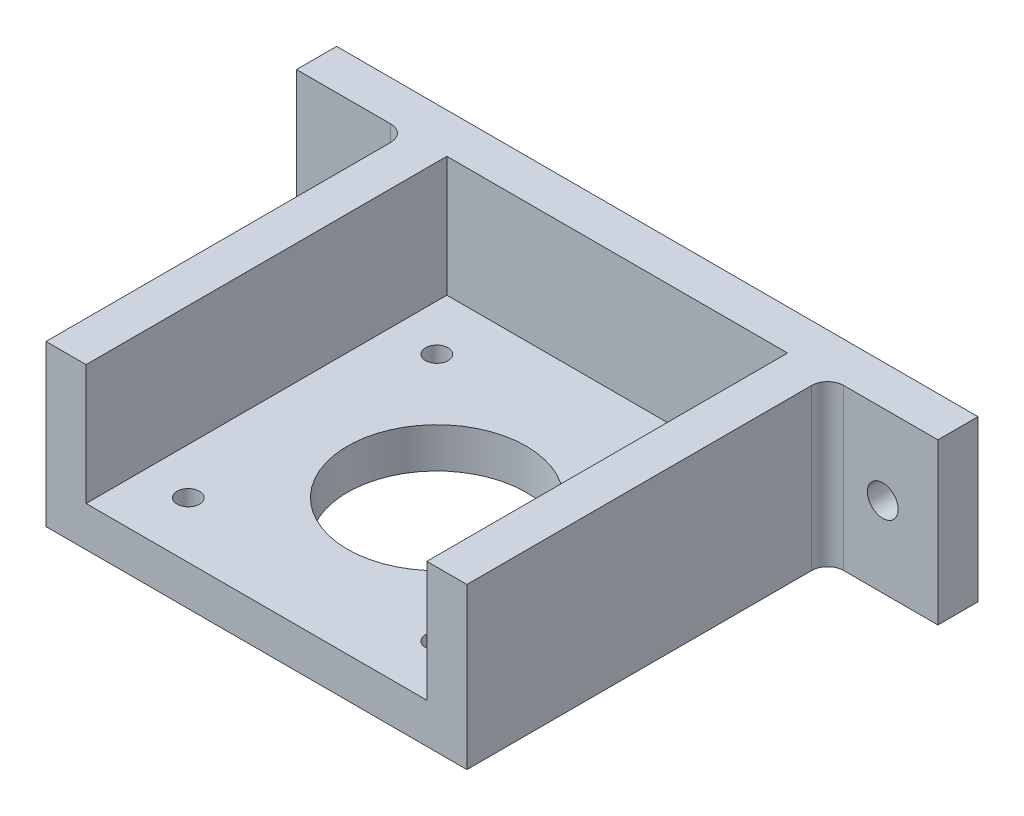
ISO-10303-21;
HEADER;
FILE_DESCRIPTION(('STEP AP214'),'2;1');
FILE_NAME('part.step','',(''),(''),'','','');
FILE_SCHEMA(('AUTOMOTIVE_DESIGN { 1 0 10303 214 1 1 1 1 }'));
ENDSEC;
DATA;
#1=APPLICATION_CONTEXT('core data for automotive mechanical design processes');
#2=APPLICATION_PROTOCOL_DEFINITION('international standard','automotive_design',2000,#1);
#3=PRODUCT_CONTEXT('',#1,'mechanical');
#4=PRODUCT('Part','Part','',(#3));
#5=PRODUCT_RELATED_PRODUCT_CATEGORY('part','',(#4));
#6=PRODUCT_DEFINITION_FORMATION('','',#4);
#7=PRODUCT_DEFINITION_CONTEXT('part definition',#1,'design');
#8=PRODUCT_DEFINITION('design','',#6,#7);
#9=PRODUCT_DEFINITION_SHAPE('','',#8);
#10=(LENGTH_UNIT() NAMED_UNIT(*) SI_UNIT(.MILLI.,.METRE.));
#11=(NAMED_UNIT(*) PLANE_ANGLE_UNIT() SI_UNIT($,.RADIAN.));
#12=(NAMED_UNIT(*) SI_UNIT($,.STERADIAN.) SOLID_ANGLE_UNIT());
#13=UNCERTAINTY_MEASURE_WITH_UNIT(LENGTH_MEASURE(1.E-05),#10,'distance_accuracy_value','');
#14=(GEOMETRIC_REPRESENTATION_CONTEXT(3) GLOBAL_UNCERTAINTY_ASSIGNED_CONTEXT((#13)) GLOBAL_UNIT_ASSIGNED_CONTEXT((#10,
#11,#12)) REPRESENTATION_CONTEXT('',''));
#15=CARTESIAN_POINT('',(0.,0.,0.));
#16=DIRECTION('',(0.,0.,1.));
#17=DIRECTION('',(1.,0.,0.));
#18=AXIS2_PLACEMENT_3D('',#15,#16,#17);
#19=CARTESIAN_POINT('',(-26.25,0.,45.));
#20=DIRECTION('',(1.,0.,0.));
#21=DIRECTION('',(0.,0.,-1.));
#22=AXIS2_PLACEMENT_3D('',#19,#20,#21);
#23=PLANE('',#22);
#24=DIRECTION('',(0.,0.,-1.));
#25=VECTOR('',#24,1.);
#26=CARTESIAN_POINT('',(-26.25,20.,45.));
#27=LINE('',#26,#25);
#28=CARTESIAN_POINT('',(-26.25,20.,45.));
#29=VERTEX_POINT('',#28);
#30=CARTESIAN_POINT('',(-26.25,20.,2.00000000000002));
#31=VERTEX_POINT('',#30);
#32=EDGE_CURVE('E198',#29,#31,#27,.T.);
#33=ORIENTED_EDGE('',*,*,#32,.T.);
#34=DIRECTION('',(0.,-1.,0.));
#35=VECTOR('',#34,1.);
#36=CARTESIAN_POINT('',(-26.25,0.,2.));
#37=LINE('',#36,#35);
#38=CARTESIAN_POINT('',(-26.25,0.,2.00000000000002));
#39=VERTEX_POINT('',#38);
#40=EDGE_CURVE('E184',#31,#39,#37,.T.);
#41=ORIENTED_EDGE('',*,*,#40,.T.);
#42=DIRECTION('',(0.,0.,-1.));
#43=VECTOR('',#42,1.);
#44=CARTESIAN_POINT('',(-26.25,0.,45.));
#45=LINE('',#44,#43);
#46=CARTESIAN_POINT('',(-26.25,0.,45.));
#47=VERTEX_POINT('',#46);
#48=EDGE_CURVE('E213',#47,#39,#45,.T.);
#49=ORIENTED_EDGE('',*,*,#48,.F.);
#50=DIRECTION('',(0.,-1.,0.));
#51=VECTOR('',#50,1.);
#52=CARTESIAN_POINT('',(-26.25,0.,45.));
#53=LINE('',#52,#51);
#54=EDGE_CURVE('E208',#29,#47,#53,.T.);
#55=ORIENTED_EDGE('',*,*,#54,.F.);
#56=EDGE_LOOP('',(#33,#41,#49,#55));
#57=FACE_BOUND('',#56,.T.);
#58=ADVANCED_FACE('F32',(#57),#23,.F.);
#59=CARTESIAN_POINT('',(26.25,0.,45.));
#60=DIRECTION('',(0.,1.,0.));
#61=DIRECTION('',(0.,0.,1.));
#62=AXIS2_PLACEMENT_3D('',#59,#60,#61);
#63=PLANE('',#62);
#64=CARTESIAN_POINT('',(15.5,0.,38.));
#65=DIRECTION('',(0.,1.,0.));
#66=DIRECTION('',(0.,0.,1.));
#67=AXIS2_PLACEMENT_3D('',#64,#65,#66);
#68=CIRCLE('',#67,1.4);
#69=CARTESIAN_POINT('',(15.5,0.,39.4));
#70=VERTEX_POINT('',#69);
#71=EDGE_CURVE('E556',#70,#70,#68,.T.);
#72=ORIENTED_EDGE('',*,*,#71,.T.);
#73=EDGE_LOOP('',(#72));
#74=FACE_BOUND('',#73,.T.);
#75=CARTESIAN_POINT('',(-15.5,0.,38.));
#76=DIRECTION('',(0.,1.,0.));
#77=DIRECTION('',(0.,0.,1.));
#78=AXIS2_PLACEMENT_3D('',#75,#76,#77);
#79=CIRCLE('',#78,1.4);
#80=CARTESIAN_POINT('',(-15.5,0.,39.4));
#81=VERTEX_POINT('',#80);
#82=EDGE_CURVE('E550',#81,#81,#79,.T.);
#83=ORIENTED_EDGE('',*,*,#82,.T.);
#84=EDGE_LOOP('',(#83));
#85=FACE_BOUND('',#84,.T.);
#86=CARTESIAN_POINT('',(15.5,0.,7.));
#87=DIRECTION('',(0.,1.,0.));
#88=DIRECTION('',(0.,0.,1.));
#89=AXIS2_PLACEMENT_3D('',#86,#87,#88);
#90=CIRCLE('',#89,1.4);
#91=CARTESIAN_POINT('',(15.5,0.,8.4));
#92=VERTEX_POINT('',#91);
#93=EDGE_CURVE('E544',#92,#92,#90,.T.);
#94=ORIENTED_EDGE('',*,*,#93,.T.);
#95=EDGE_LOOP('',(#94));
#96=FACE_BOUND('',#95,.T.);
#97=CARTESIAN_POINT('',(-15.5,0.,7.));
#98=DIRECTION('',(0.,1.,0.));
#99=DIRECTION('',(0.,0.,1.));
#100=AXIS2_PLACEMENT_3D('',#97,#98,#99);
#101=CIRCLE('',#100,1.4);
#102=CARTESIAN_POINT('',(-15.5,0.,8.4));
#103=VERTEX_POINT('',#102);
#104=EDGE_CURVE('E538',#103,#103,#101,.T.);
#105=ORIENTED_EDGE('',*,*,#104,.T.);
#106=EDGE_LOOP('',(#105));
#107=FACE_BOUND('',#106,.T.);
#108=CARTESIAN_POINT('',(0.,0.,22.5));
#109=DIRECTION('',(0.,1.,0.));
#110=DIRECTION('',(0.,0.,1.));
#111=AXIS2_PLACEMENT_3D('',#108,#109,#110);
#112=CIRCLE('',#111,11.15);
#113=CARTESIAN_POINT('',(0.,0.,33.65));
#114=VERTEX_POINT('',#113);
#115=EDGE_CURVE('E532',#114,#114,#112,.T.);
#116=ORIENTED_EDGE('',*,*,#115,.T.);
#117=EDGE_LOOP('',(#116));
#118=FACE_BOUND('',#117,.T.);
#119=ORIENTED_EDGE('',*,*,#48,.T.);
#120=CARTESIAN_POINT('',(-28.25,0.,2.));
#121=DIRECTION('',(0.,1.,0.));
#122=DIRECTION('',(0.,0.,1.));
#123=AXIS2_PLACEMENT_3D('',#120,#121,#122);
#124=CIRCLE('',#123,2.);
#125=CARTESIAN_POINT('',(-28.25,0.,0.));
#126=VERTEX_POINT('',#125);
#127=EDGE_CURVE('E188',#39,#126,#124,.T.);
#128=ORIENTED_EDGE('',*,*,#127,.T.);
#129=DIRECTION('',(-1.,0.,0.));
#130=VECTOR('',#129,1.);
#131=CARTESIAN_POINT('',(40.,0.,0.));
#132=LINE('',#131,#130);
#133=CARTESIAN_POINT('',(-40.,0.,0.));
#134=VERTEX_POINT('',#133);
#135=EDGE_CURVE('E170',#126,#134,#132,.T.);
#136=ORIENTED_EDGE('',*,*,#135,.T.);
#137=DIRECTION('',(0.,0.,-1.));
#138=VECTOR('',#137,1.);
#139=CARTESIAN_POINT('',(-40.,0.,-5.));
#140=LINE('',#139,#138);
#141=CARTESIAN_POINT('',(-40.,0.,-5.));
#142=VERTEX_POINT('',#141);
#143=EDGE_CURVE('E156',#134,#142,#140,.T.);
#144=ORIENTED_EDGE('',*,*,#143,.T.);
#145=DIRECTION('',(-1.,0.,0.));
#146=VECTOR('',#145,1.);
#147=CARTESIAN_POINT('',(40.,0.,-5.));
#148=LINE('',#147,#146);
#149=CARTESIAN_POINT('',(40.,0.,-5.));
#150=VERTEX_POINT('',#149);
#151=EDGE_CURVE('E137',#150,#142,#148,.T.);
#152=ORIENTED_EDGE('',*,*,#151,.F.);
#153=DIRECTION('',(0.,0.,-1.));
#154=VECTOR('',#153,1.);
#155=CARTESIAN_POINT('',(40.,0.,-5.));
#156=LINE('',#155,#154);
#157=CARTESIAN_POINT('',(40.,0.,0.));
#158=VERTEX_POINT('',#157);
#159=EDGE_CURVE('E144',#158,#150,#156,.T.);
#160=ORIENTED_EDGE('',*,*,#159,.F.);
#161=CARTESIAN_POINT('',(28.25,0.,0.));
#162=VERTEX_POINT('',#161);
#163=EDGE_CURVE('E166',#158,#162,#132,.T.);
#164=ORIENTED_EDGE('',*,*,#163,.T.);
#165=CARTESIAN_POINT('',(28.25,0.,2.));
#166=DIRECTION('',(0.,1.,0.));
#167=DIRECTION('',(0.,0.,1.));
#168=AXIS2_PLACEMENT_3D('',#165,#166,#167);
#169=CIRCLE('',#168,2.);
#170=CARTESIAN_POINT('',(26.25,0.,2.00000000000002));
#171=VERTEX_POINT('',#170);
#172=EDGE_CURVE('E11',#162,#171,#169,.T.);
#173=ORIENTED_EDGE('',*,*,#172,.T.);
#174=DIRECTION('',(0.,0.,-1.));
#175=VECTOR('',#174,1.);
#176=CARTESIAN_POINT('',(26.25,0.,45.));
#177=LINE('',#176,#175);
#178=CARTESIAN_POINT('',(26.25,0.,45.));
#179=VERTEX_POINT('',#178);
#180=EDGE_CURVE('E214',#179,#171,#177,.T.);
#181=ORIENTED_EDGE('',*,*,#180,.F.);
#182=DIRECTION('',(1.,0.,0.));
#183=VECTOR('',#182,1.);
#184=CARTESIAN_POINT('',(26.25,0.,45.));
#185=LINE('',#184,#183);
#186=EDGE_CURVE('E284',#47,#179,#185,.T.);
#187=ORIENTED_EDGE('',*,*,#186,.F.);
#188=EDGE_LOOP('',(#119,#128,#136,#144,#152,#160,#164,#173,#181,#187));
#189=FACE_BOUND('',#188,.T.);
#190=ADVANCED_FACE('F154',(#74,#85,#96,#107,#118,#189),#63,.F.);
#191=CARTESIAN_POINT('',(26.25,0.,45.));
#192=DIRECTION('',(-1.,0.,0.));
#193=DIRECTION('',(0.,0.,1.));
#194=AXIS2_PLACEMENT_3D('',#191,#192,#193);
#195=PLANE('',#194);
#196=ORIENTED_EDGE('',*,*,#180,.T.);
#197=DIRECTION('',(0.,1.,0.));
#198=VECTOR('',#197,1.);
#199=CARTESIAN_POINT('',(26.25,20.,2.));
#200=LINE('',#199,#198);
#201=CARTESIAN_POINT('',(26.25,20.,2.00000000000002));
#202=VERTEX_POINT('',#201);
#203=EDGE_CURVE('E183',#171,#202,#200,.T.);
#204=ORIENTED_EDGE('',*,*,#203,.T.);
#205=DIRECTION('',(0.,0.,-1.));
#206=VECTOR('',#205,1.);
#207=CARTESIAN_POINT('',(26.25,20.,45.));
#208=LINE('',#207,#206);
#209=CARTESIAN_POINT('',(26.25,20.,45.));
#210=VERTEX_POINT('',#209);
#211=EDGE_CURVE('E226',#210,#202,#208,.T.);
#212=ORIENTED_EDGE('',*,*,#211,.F.);
#213=DIRECTION('',(0.,1.,0.));
#214=VECTOR('',#213,1.);
#215=CARTESIAN_POINT('',(26.25,0.,45.));
#216=LINE('',#215,#214);
#217=EDGE_CURVE('E261',#179,#210,#216,.T.);
#218=ORIENTED_EDGE('',*,*,#217,.F.);
#219=EDGE_LOOP('',(#196,#204,#212,#218));
#220=FACE_BOUND('',#219,.T.);
#221=ADVANCED_FACE('F259',(#220),#195,.F.);
#222=CARTESIAN_POINT('',(21.25,20.,45.));
#223=DIRECTION('',(1.,0.,0.));
#224=DIRECTION('',(0.,1.,0.));
#225=AXIS2_PLACEMENT_3D('',#222,#223,#224);
#226=PLANE('',#225);
#227=DIRECTION('',(0.,-1.,0.));
#228=VECTOR('',#227,1.);
#229=CARTESIAN_POINT('',(21.25,20.,0.));
#230=LINE('',#229,#228);
#231=CARTESIAN_POINT('',(21.25,20.,0.));
#232=VERTEX_POINT('',#231);
#233=CARTESIAN_POINT('',(21.25,4.99999999999999,0.));
#234=VERTEX_POINT('',#233);
#235=EDGE_CURVE('E157',#232,#234,#230,.T.);
#236=ORIENTED_EDGE('',*,*,#235,.T.);
#237=DIRECTION('',(0.,0.,-1.));
#238=VECTOR('',#237,1.);
#239=CARTESIAN_POINT('',(21.25,4.99999999999999,45.));
#240=LINE('',#239,#238);
#241=CARTESIAN_POINT('',(21.25,4.99999999999999,45.));
#242=VERTEX_POINT('',#241);
#243=EDGE_CURVE('E227',#242,#234,#240,.T.);
#244=ORIENTED_EDGE('',*,*,#243,.F.);
#245=DIRECTION('',(0.,-1.,0.));
#246=VECTOR('',#245,1.);
#247=CARTESIAN_POINT('',(21.25,20.,45.));
#248=LINE('',#247,#246);
#249=CARTESIAN_POINT('',(21.25,20.,45.));
#250=VERTEX_POINT('',#249);
#251=EDGE_CURVE('E289',#250,#242,#248,.T.);
#252=ORIENTED_EDGE('',*,*,#251,.F.);
#253=DIRECTION('',(0.,0.,-1.));
#254=VECTOR('',#253,1.);
#255=CARTESIAN_POINT('',(21.25,20.,45.));
#256=LINE('',#255,#254);
#257=EDGE_CURVE('E223',#250,#232,#256,.T.);
#258=ORIENTED_EDGE('',*,*,#257,.T.);
#259=EDGE_LOOP('',(#236,#244,#252,#258));
#260=FACE_BOUND('',#259,.T.);
#261=ADVANCED_FACE('F310',(#260),#226,.F.);
#262=CARTESIAN_POINT('',(-21.25,5.,45.));
#263=DIRECTION('',(0.,-1.,0.));
#264=DIRECTION('',(1.,0.,0.));
#265=AXIS2_PLACEMENT_3D('',#262,#263,#264);
#266=PLANE('',#265);
#267=CARTESIAN_POINT('',(15.5,5.,38.));
#268=DIRECTION('',(0.,1.,0.));
#269=DIRECTION('',(0.,0.,1.));
#270=AXIS2_PLACEMENT_3D('',#267,#268,#269);
#271=CIRCLE('',#270,1.4);
#272=CARTESIAN_POINT('',(15.5,5.,39.4));
#273=VERTEX_POINT('',#272);
#274=EDGE_CURVE('E559',#273,#273,#271,.T.);
#275=ORIENTED_EDGE('',*,*,#274,.F.);
#276=EDGE_LOOP('',(#275));
#277=FACE_BOUND('',#276,.T.);
#278=CARTESIAN_POINT('',(-15.5,5.,38.));
#279=DIRECTION('',(0.,1.,0.));
#280=DIRECTION('',(0.,0.,-1.));
#281=AXIS2_PLACEMENT_3D('',#278,#279,#280);
#282=CIRCLE('',#281,1.4);
#283=CARTESIAN_POINT('',(-15.5,5.,36.6));
#284=VERTEX_POINT('',#283);
#285=EDGE_CURVE('E553',#284,#284,#282,.T.);
#286=ORIENTED_EDGE('',*,*,#285,.F.);
#287=EDGE_LOOP('',(#286));
#288=FACE_BOUND('',#287,.T.);
#289=CARTESIAN_POINT('',(15.5,5.,7.));
#290=DIRECTION('',(0.,1.,0.));
#291=DIRECTION('',(0.,0.,-1.));
#292=AXIS2_PLACEMENT_3D('',#289,#290,#291);
#293=CIRCLE('',#292,1.4);
#294=CARTESIAN_POINT('',(15.5,5.,5.6));
#295=VERTEX_POINT('',#294);
#296=EDGE_CURVE('E547',#295,#295,#293,.T.);
#297=ORIENTED_EDGE('',*,*,#296,.F.);
#298=EDGE_LOOP('',(#297));
#299=FACE_BOUND('',#298,.T.);
#300=CARTESIAN_POINT('',(-15.5,5.,7.));
#301=DIRECTION('',(0.,1.,0.));
#302=DIRECTION('',(0.,0.,1.));
#303=AXIS2_PLACEMENT_3D('',#300,#301,#302);
#304=CIRCLE('',#303,1.4);
#305=CARTESIAN_POINT('',(-15.5,5.,8.4));
#306=VERTEX_POINT('',#305);
#307=EDGE_CURVE('E541',#306,#306,#304,.T.);
#308=ORIENTED_EDGE('',*,*,#307,.F.);
#309=EDGE_LOOP('',(#308));
#310=FACE_BOUND('',#309,.T.);
#311=CARTESIAN_POINT('',(0.,5.,22.5));
#312=DIRECTION('',(0.,1.,0.));
#313=DIRECTION('',(0.,0.,1.));
#314=AXIS2_PLACEMENT_3D('',#311,#312,#313);
#315=CIRCLE('',#314,11.15);
#316=CARTESIAN_POINT('',(0.,5.,33.65));
#317=VERTEX_POINT('',#316);
#318=EDGE_CURVE('E535',#317,#317,#315,.T.);
#319=ORIENTED_EDGE('',*,*,#318,.F.);
#320=EDGE_LOOP('',(#319));
#321=FACE_BOUND('',#320,.T.);
#322=DIRECTION('',(-1.,0.,0.));
#323=VECTOR('',#322,1.);
#324=CARTESIAN_POINT('',(-21.25,5.,0.));
#325=LINE('',#324,#323);
#326=CARTESIAN_POINT('',(-21.25,5.,0.));
#327=VERTEX_POINT('',#326);
#328=EDGE_CURVE('E160',#234,#327,#325,.T.);
#329=ORIENTED_EDGE('',*,*,#328,.T.);
#330=DIRECTION('',(0.,0.,-1.));
#331=VECTOR('',#330,1.);
#332=CARTESIAN_POINT('',(-21.25,5.,45.));
#333=LINE('',#332,#331);
#334=CARTESIAN_POINT('',(-21.25,5.,45.));
#335=VERTEX_POINT('',#334);
#336=EDGE_CURVE('E233',#335,#327,#333,.T.);
#337=ORIENTED_EDGE('',*,*,#336,.F.);
#338=DIRECTION('',(-1.,0.,0.));
#339=VECTOR('',#338,1.);
#340=CARTESIAN_POINT('',(-21.25,5.,45.));
#341=LINE('',#340,#339);
#342=EDGE_CURVE('E291',#242,#335,#341,.T.);
#343=ORIENTED_EDGE('',*,*,#342,.F.);
#344=ORIENTED_EDGE('',*,*,#243,.T.);
#345=EDGE_LOOP('',(#329,#337,#343,#344));
#346=FACE_BOUND('',#345,.T.);
#347=ADVANCED_FACE('F305',(#277,#288,#299,#310,#321,#346),#266,.F.);
#348=CARTESIAN_POINT('',(-21.25,20.,45.));
#349=DIRECTION('',(-1.,0.,0.));
#350=DIRECTION('',(0.,-1.,0.));
#351=AXIS2_PLACEMENT_3D('',#348,#349,#350);
#352=PLANE('',#351);
#353=DIRECTION('',(0.,1.,0.));
#354=VECTOR('',#353,1.);
#355=CARTESIAN_POINT('',(-21.25,20.,0.));
#356=LINE('',#355,#354);
#357=CARTESIAN_POINT('',(-21.25,20.,0.));
#358=VERTEX_POINT('',#357);
#359=EDGE_CURVE('E234',#327,#358,#356,.T.);
#360=ORIENTED_EDGE('',*,*,#359,.T.);
#361=DIRECTION('',(0.,0.,-1.));
#362=VECTOR('',#361,1.);
#363=CARTESIAN_POINT('',(-21.25,20.,45.));
#364=LINE('',#363,#362);
#365=CARTESIAN_POINT('',(-21.25,20.,45.));
#366=VERTEX_POINT('',#365);
#367=EDGE_CURVE('E209',#366,#358,#364,.T.);
#368=ORIENTED_EDGE('',*,*,#367,.F.);
#369=DIRECTION('',(0.,1.,0.));
#370=VECTOR('',#369,1.);
#371=CARTESIAN_POINT('',(-21.25,20.,45.));
#372=LINE('',#371,#370);
#373=EDGE_CURVE('E293',#335,#366,#372,.T.);
#374=ORIENTED_EDGE('',*,*,#373,.F.);
#375=ORIENTED_EDGE('',*,*,#336,.T.);
#376=EDGE_LOOP('',(#360,#368,#374,#375));
#377=FACE_BOUND('',#376,.T.);
#378=ADVANCED_FACE('F300',(#377),#352,.F.);
#379=CARTESIAN_POINT('',(-26.25,20.,45.));
#380=DIRECTION('',(0.,-1.,0.));
#381=DIRECTION('',(0.,0.,-1.));
#382=AXIS2_PLACEMENT_3D('',#379,#380,#381);
#383=PLANE('',#382);
#384=ORIENTED_EDGE('',*,*,#367,.T.);
#385=DIRECTION('',(-1.,0.,0.));
#386=VECTOR('',#385,1.);
#387=CARTESIAN_POINT('',(40.,20.,0.));
#388=LINE('',#387,#386);
#389=EDGE_CURVE('E279',#232,#358,#388,.T.);
#390=ORIENTED_EDGE('',*,*,#389,.F.);
#391=ORIENTED_EDGE('',*,*,#257,.F.);
#392=DIRECTION('',(-1.,0.,0.));
#393=VECTOR('',#392,1.);
#394=CARTESIAN_POINT('',(26.25,20.,45.));
#395=LINE('',#394,#393);
#396=EDGE_CURVE('E287',#210,#250,#395,.T.);
#397=ORIENTED_EDGE('',*,*,#396,.F.);
#398=ORIENTED_EDGE('',*,*,#211,.T.);
#399=CARTESIAN_POINT('',(28.25,20.,2.));
#400=DIRECTION('',(0.,-1.,0.));
#401=DIRECTION('',(0.,0.,-1.));
#402=AXIS2_PLACEMENT_3D('',#399,#400,#401);
#403=CIRCLE('',#402,2.);
#404=CARTESIAN_POINT('',(28.25,20.,0.));
#405=VERTEX_POINT('',#404);
#406=EDGE_CURVE('E40',#202,#405,#403,.T.);
#407=ORIENTED_EDGE('',*,*,#406,.T.);
#408=CARTESIAN_POINT('',(40.,20.,0.));
#409=VERTEX_POINT('',#408);
#410=EDGE_CURVE('E162',#409,#405,#388,.T.);
#411=ORIENTED_EDGE('',*,*,#410,.F.);
#412=DIRECTION('',(0.,0.,1.));
#413=VECTOR('',#412,1.);
#414=CARTESIAN_POINT('',(40.,20.,0.));
#415=LINE('',#414,#413);
#416=CARTESIAN_POINT('',(40.,20.,-5.));
#417=VERTEX_POINT('',#416);
#418=EDGE_CURVE('E143',#417,#409,#415,.T.);
#419=ORIENTED_EDGE('',*,*,#418,.F.);
#420=DIRECTION('',(-1.,0.,0.));
#421=VECTOR('',#420,1.);
#422=CARTESIAN_POINT('',(40.,20.,-5.));
#423=LINE('',#422,#421);
#424=CARTESIAN_POINT('',(-40.,20.,-5.));
#425=VERTEX_POINT('',#424);
#426=EDGE_CURVE('E140',#417,#425,#423,.T.);
#427=ORIENTED_EDGE('',*,*,#426,.T.);
#428=DIRECTION('',(0.,0.,1.));
#429=VECTOR('',#428,1.);
#430=CARTESIAN_POINT('',(-40.,20.,0.));
#431=LINE('',#430,#429);
#432=CARTESIAN_POINT('',(-40.,20.,0.));
#433=VERTEX_POINT('',#432);
#434=EDGE_CURVE('E270',#425,#433,#431,.T.);
#435=ORIENTED_EDGE('',*,*,#434,.T.);
#436=CARTESIAN_POINT('',(-28.25,20.,0.));
#437=VERTEX_POINT('',#436);
#438=EDGE_CURVE('E169',#437,#433,#388,.T.);
#439=ORIENTED_EDGE('',*,*,#438,.F.);
#440=CARTESIAN_POINT('',(-28.25,20.,2.));
#441=DIRECTION('',(0.,-1.,0.));
#442=DIRECTION('',(0.,0.,-1.));
#443=AXIS2_PLACEMENT_3D('',#440,#441,#442);
#444=CIRCLE('',#443,2.);
#445=EDGE_CURVE('E190',#437,#31,#444,.T.);
#446=ORIENTED_EDGE('',*,*,#445,.T.);
#447=ORIENTED_EDGE('',*,*,#32,.F.);
#448=DIRECTION('',(-1.,0.,0.));
#449=VECTOR('',#448,1.);
#450=CARTESIAN_POINT('',(-26.25,20.,45.));
#451=LINE('',#450,#449);
#452=EDGE_CURVE('E210',#366,#29,#451,.T.);
#453=ORIENTED_EDGE('',*,*,#452,.F.);
#454=EDGE_LOOP('',(#384,#390,#391,#397,#398,#407,#411,#419,#427,#435,#439,#446,#447,#453));
#455=FACE_BOUND('',#454,.T.);
#456=ADVANCED_FACE('F196',(#455),#383,.F.);
#457=CARTESIAN_POINT('',(0.,0.,45.));
#458=DIRECTION('',(0.,0.,-1.));
#459=DIRECTION('',(-1.,0.,0.));
#460=AXIS2_PLACEMENT_3D('',#457,#458,#459);
#461=PLANE('',#460);
#462=ORIENTED_EDGE('',*,*,#54,.T.);
#463=ORIENTED_EDGE('',*,*,#186,.T.);
#464=ORIENTED_EDGE('',*,*,#217,.T.);
#465=ORIENTED_EDGE('',*,*,#396,.T.);
#466=ORIENTED_EDGE('',*,*,#251,.T.);
#467=ORIENTED_EDGE('',*,*,#342,.T.);
#468=ORIENTED_EDGE('',*,*,#373,.T.);
#469=ORIENTED_EDGE('',*,*,#452,.T.);
#470=EDGE_LOOP('',(#462,#463,#464,#465,#466,#467,#468,#469));
#471=FACE_BOUND('',#470,.T.);
#472=ADVANCED_FACE('F295',(#471),#461,.F.);
#473=CARTESIAN_POINT('',(40.,0.,0.));
#474=DIRECTION('',(0.,0.,-1.));
#475=DIRECTION('',(-1.,0.,0.));
#476=AXIS2_PLACEMENT_3D('',#473,#474,#475);
#477=PLANE('',#476);
#478=CARTESIAN_POINT('',(-33.125,9.99999999999999,0.));
#479=DIRECTION('',(0.,0.,1.));
#480=DIRECTION('',(1.,0.,0.));
#481=AXIS2_PLACEMENT_3D('',#478,#479,#480);
#482=CIRCLE('',#481,1.925);
#483=CARTESIAN_POINT('',(-31.2,9.99999999999999,0.));
#484=VERTEX_POINT('',#483);
#485=EDGE_CURVE('E220',#484,#484,#482,.T.);
#486=ORIENTED_EDGE('',*,*,#485,.F.);
#487=EDGE_LOOP('',(#486));
#488=FACE_BOUND('',#487,.T.);
#489=ORIENTED_EDGE('',*,*,#135,.F.);
#490=DIRECTION('',(0.,-1.,0.));
#491=VECTOR('',#490,1.);
#492=CARTESIAN_POINT('',(-28.25,20.,0.));
#493=LINE('',#492,#491);
#494=EDGE_CURVE('E181',#126,#437,#493,.F.);
#495=ORIENTED_EDGE('',*,*,#494,.T.);
#496=ORIENTED_EDGE('',*,*,#438,.T.);
#497=DIRECTION('',(0.,-1.,0.));
#498=VECTOR('',#497,1.);
#499=CARTESIAN_POINT('',(-40.,0.,0.));
#500=LINE('',#499,#498);
#501=EDGE_CURVE('E151',#433,#134,#500,.T.);
#502=ORIENTED_EDGE('',*,*,#501,.T.);
#503=EDGE_LOOP('',(#489,#495,#496,#502));
#504=FACE_BOUND('',#503,.T.);
#505=ADVANCED_FACE('F276',(#488,#504),#477,.F.);
#506=ORIENTED_EDGE('',*,*,#359,.F.);
#507=ORIENTED_EDGE('',*,*,#328,.F.);
#508=ORIENTED_EDGE('',*,*,#235,.F.);
#509=ORIENTED_EDGE('',*,*,#389,.T.);
#510=EDGE_LOOP('',(#506,#507,#508,#509));
#511=FACE_BOUND('',#510,.T.);
#512=ADVANCED_FACE('F303',(#511),#477,.F.);
#513=CARTESIAN_POINT('',(40.,20.,-5.));
#514=DIRECTION('',(0.,0.,1.));
#515=DIRECTION('',(0.,-1.,0.));
#516=AXIS2_PLACEMENT_3D('',#513,#514,#515);
#517=PLANE('',#516);
#518=CARTESIAN_POINT('',(33.125,9.99999999999999,-5.));
#519=DIRECTION('',(0.,0.,1.));
#520=DIRECTION('',(0.,-1.,0.));
#521=AXIS2_PLACEMENT_3D('',#518,#519,#520);
#522=CIRCLE('',#521,1.925);
#523=CARTESIAN_POINT('',(33.125,8.07499999999999,-5.));
#524=VERTEX_POINT('',#523);
#525=EDGE_CURVE('E524',#524,#524,#522,.T.);
#526=ORIENTED_EDGE('',*,*,#525,.T.);
#527=EDGE_LOOP('',(#526));
#528=FACE_BOUND('',#527,.T.);
#529=CARTESIAN_POINT('',(-33.125,9.99999999999999,-5.));
#530=DIRECTION('',(0.,0.,1.));
#531=DIRECTION('',(0.,-1.,0.));
#532=AXIS2_PLACEMENT_3D('',#529,#530,#531);
#533=CIRCLE('',#532,1.925);
#534=CARTESIAN_POINT('',(-33.125,8.075,-5.));
#535=VERTEX_POINT('',#534);
#536=EDGE_CURVE('E217',#535,#535,#533,.T.);
#537=ORIENTED_EDGE('',*,*,#536,.T.);
#538=EDGE_LOOP('',(#537));
#539=FACE_BOUND('',#538,.T.);
#540=DIRECTION('',(0.,1.,0.));
#541=VECTOR('',#540,1.);
#542=CARTESIAN_POINT('',(-40.,20.,-5.));
#543=LINE('',#542,#541);
#544=EDGE_CURVE('E269',#142,#425,#543,.T.);
#545=ORIENTED_EDGE('',*,*,#544,.T.);
#546=ORIENTED_EDGE('',*,*,#426,.F.);
#547=DIRECTION('',(0.,1.,0.));
#548=VECTOR('',#547,1.);
#549=CARTESIAN_POINT('',(40.,20.,-5.));
#550=LINE('',#549,#548);
#551=EDGE_CURVE('E133',#150,#417,#550,.T.);
#552=ORIENTED_EDGE('',*,*,#551,.F.);
#553=ORIENTED_EDGE('',*,*,#151,.T.);
#554=EDGE_LOOP('',(#545,#546,#552,#553));
#555=FACE_BOUND('',#554,.T.);
#556=ADVANCED_FACE('F135',(#528,#539,#555),#517,.F.);
#557=CARTESIAN_POINT('',(33.125,9.99999999999999,0.));
#558=DIRECTION('',(0.,0.,1.));
#559=DIRECTION('',(-1.,0.,0.));
#560=AXIS2_PLACEMENT_3D('',#557,#558,#559);
#561=CIRCLE('',#560,1.925);
#562=CARTESIAN_POINT('',(31.2,9.99999999999999,0.));
#563=VERTEX_POINT('',#562);
#564=EDGE_CURVE('E527',#563,#563,#561,.T.);
#565=ORIENTED_EDGE('',*,*,#564,.F.);
#566=EDGE_LOOP('',(#565));
#567=FACE_BOUND('',#566,.T.);
#568=ORIENTED_EDGE('',*,*,#410,.T.);
#569=DIRECTION('',(0.,1.,0.));
#570=VECTOR('',#569,1.);
#571=CARTESIAN_POINT('',(28.25,0.,0.));
#572=LINE('',#571,#570);
#573=EDGE_CURVE('E53',#405,#162,#572,.F.);
#574=ORIENTED_EDGE('',*,*,#573,.T.);
#575=ORIENTED_EDGE('',*,*,#163,.F.);
#576=DIRECTION('',(0.,-1.,0.));
#577=VECTOR('',#576,1.);
#578=CARTESIAN_POINT('',(40.,0.,0.));
#579=LINE('',#578,#577);
#580=EDGE_CURVE('E149',#409,#158,#579,.T.);
#581=ORIENTED_EDGE('',*,*,#580,.F.);
#582=EDGE_LOOP('',(#568,#574,#575,#581));
#583=FACE_BOUND('',#582,.T.);
#584=ADVANCED_FACE('F264',(#567,#583),#477,.F.);
#585=CARTESIAN_POINT('',(40.,0.,0.));
#586=DIRECTION('',(-1.,0.,0.));
#587=DIRECTION('',(0.,0.,1.));
#588=AXIS2_PLACEMENT_3D('',#585,#586,#587);
#589=PLANE('',#588);
#590=ORIENTED_EDGE('',*,*,#159,.T.);
#591=ORIENTED_EDGE('',*,*,#551,.T.);
#592=ORIENTED_EDGE('',*,*,#418,.T.);
#593=ORIENTED_EDGE('',*,*,#580,.T.);
#594=EDGE_LOOP('',(#590,#591,#592,#593));
#595=FACE_BOUND('',#594,.T.);
#596=ADVANCED_FACE('F147',(#595),#589,.F.);
#597=CARTESIAN_POINT('',(-40.,0.,0.));
#598=DIRECTION('',(-1.,0.,0.));
#599=DIRECTION('',(0.,0.,1.));
#600=AXIS2_PLACEMENT_3D('',#597,#598,#599);
#601=PLANE('',#600);
#602=ORIENTED_EDGE('',*,*,#143,.F.);
#603=ORIENTED_EDGE('',*,*,#501,.F.);
#604=ORIENTED_EDGE('',*,*,#434,.F.);
#605=ORIENTED_EDGE('',*,*,#544,.F.);
#606=EDGE_LOOP('',(#602,#603,#604,#605));
#607=FACE_BOUND('',#606,.T.);
#608=ADVANCED_FACE('F278',(#607),#601,.T.);
#609=CARTESIAN_POINT('',(-33.125,9.99999999999999,-200.));
#610=DIRECTION('',(0.,0.,1.));
#611=DIRECTION('',(1.,0.,0.));
#612=AXIS2_PLACEMENT_3D('',#609,#610,#611);
#613=CYLINDRICAL_SURFACE('',#612,1.925);
#614=ORIENTED_EDGE('',*,*,#485,.T.);
#615=EDGE_LOOP('',(#614));
#616=FACE_BOUND('',#615,.T.);
#617=ORIENTED_EDGE('',*,*,#536,.F.);
#618=EDGE_LOOP('',(#617));
#619=FACE_BOUND('',#618,.T.);
#620=ADVANCED_FACE('F360',(#616,#619),#613,.F.);
#621=CARTESIAN_POINT('',(33.125,9.99999999999999,-200.));
#622=DIRECTION('',(0.,0.,1.));
#623=DIRECTION('',(1.,0.,0.));
#624=AXIS2_PLACEMENT_3D('',#621,#622,#623);
#625=CYLINDRICAL_SURFACE('',#624,1.925);
#626=ORIENTED_EDGE('',*,*,#564,.T.);
#627=EDGE_LOOP('',(#626));
#628=FACE_BOUND('',#627,.T.);
#629=ORIENTED_EDGE('',*,*,#525,.F.);
#630=EDGE_LOOP('',(#629));
#631=FACE_BOUND('',#630,.T.);
#632=ADVANCED_FACE('F356',(#628,#631),#625,.F.);
#633=CARTESIAN_POINT('',(0.,-195.,22.5));
#634=DIRECTION('',(0.,1.,0.));
#635=DIRECTION('',(0.,0.,1.));
#636=AXIS2_PLACEMENT_3D('',#633,#634,#635);
#637=CYLINDRICAL_SURFACE('',#636,11.15);
#638=ORIENTED_EDGE('',*,*,#318,.T.);
#639=EDGE_LOOP('',(#638));
#640=FACE_BOUND('',#639,.T.);
#641=ORIENTED_EDGE('',*,*,#115,.F.);
#642=EDGE_LOOP('',(#641));
#643=FACE_BOUND('',#642,.T.);
#644=ADVANCED_FACE('F352',(#640,#643),#637,.F.);
#645=CARTESIAN_POINT('',(-15.5,-195.,7.));
#646=DIRECTION('',(0.,1.,0.));
#647=DIRECTION('',(0.,0.,1.));
#648=AXIS2_PLACEMENT_3D('',#645,#646,#647);
#649=CYLINDRICAL_SURFACE('',#648,1.4);
#650=ORIENTED_EDGE('',*,*,#307,.T.);
#651=EDGE_LOOP('',(#650));
#652=FACE_BOUND('',#651,.T.);
#653=ORIENTED_EDGE('',*,*,#104,.F.);
#654=EDGE_LOOP('',(#653));
#655=FACE_BOUND('',#654,.T.);
#656=ADVANCED_FACE('F348',(#652,#655),#649,.F.);
#657=CARTESIAN_POINT('',(15.5,-195.,7.));
#658=DIRECTION('',(0.,1.,0.));
#659=DIRECTION('',(0.,0.,1.));
#660=AXIS2_PLACEMENT_3D('',#657,#658,#659);
#661=CYLINDRICAL_SURFACE('',#660,1.4);
#662=ORIENTED_EDGE('',*,*,#296,.T.);
#663=EDGE_LOOP('',(#662));
#664=FACE_BOUND('',#663,.T.);
#665=ORIENTED_EDGE('',*,*,#93,.F.);
#666=EDGE_LOOP('',(#665));
#667=FACE_BOUND('',#666,.T.);
#668=ADVANCED_FACE('F340',(#664,#667),#661,.F.);
#669=CARTESIAN_POINT('',(-15.5,-195.,38.));
#670=DIRECTION('',(0.,1.,0.));
#671=DIRECTION('',(0.,0.,1.));
#672=AXIS2_PLACEMENT_3D('',#669,#670,#671);
#673=CYLINDRICAL_SURFACE('',#672,1.4);
#674=ORIENTED_EDGE('',*,*,#285,.T.);
#675=EDGE_LOOP('',(#674));
#676=FACE_BOUND('',#675,.T.);
#677=ORIENTED_EDGE('',*,*,#82,.F.);
#678=EDGE_LOOP('',(#677));
#679=FACE_BOUND('',#678,.T.);
#680=ADVANCED_FACE('F334',(#676,#679),#673,.F.);
#681=CARTESIAN_POINT('',(15.5,-195.,38.));
#682=DIRECTION('',(0.,1.,0.));
#683=DIRECTION('',(0.,0.,1.));
#684=AXIS2_PLACEMENT_3D('',#681,#682,#683);
#685=CYLINDRICAL_SURFACE('',#684,1.4);
#686=ORIENTED_EDGE('',*,*,#274,.T.);
#687=EDGE_LOOP('',(#686));
#688=FACE_BOUND('',#687,.T.);
#689=ORIENTED_EDGE('',*,*,#71,.F.);
#690=EDGE_LOOP('',(#689));
#691=FACE_BOUND('',#690,.T.);
#692=ADVANCED_FACE('F329',(#688,#691),#685,.F.);
#693=CARTESIAN_POINT('',(-28.25,0.,2.));
#694=DIRECTION('',(0.,1.,0.));
#695=DIRECTION('',(0.,0.,1.));
#696=AXIS2_PLACEMENT_3D('',#693,#694,#695);
#697=CYLINDRICAL_SURFACE('',#696,2.);
#698=ORIENTED_EDGE('',*,*,#445,.F.);
#699=ORIENTED_EDGE('',*,*,#494,.F.);
#700=ORIENTED_EDGE('',*,*,#127,.F.);
#701=ORIENTED_EDGE('',*,*,#40,.F.);
#702=EDGE_LOOP('',(#698,#699,#700,#701));
#703=FACE_BOUND('',#702,.T.);
#704=ADVANCED_FACE('F212',(#703),#697,.F.);
#705=CARTESIAN_POINT('',(28.25,0.,2.));
#706=DIRECTION('',(0.,-1.,0.));
#707=DIRECTION('',(0.,0.,-1.));
#708=AXIS2_PLACEMENT_3D('',#705,#706,#707);
#709=CYLINDRICAL_SURFACE('',#708,2.);
#710=ORIENTED_EDGE('',*,*,#172,.F.);
#711=ORIENTED_EDGE('',*,*,#573,.F.);
#712=ORIENTED_EDGE('',*,*,#406,.F.);
#713=ORIENTED_EDGE('',*,*,#203,.F.);
#714=EDGE_LOOP('',(#710,#711,#712,#713));
#715=FACE_BOUND('',#714,.T.);
#716=ADVANCED_FACE('F34',(#715),#709,.F.);
#717=CLOSED_SHELL('',(#58,#190,#221,#261,#347,#378,#456,#472,#505,#512,#556,#584,#596,#608,#620,
#632,#644,#656,#668,#680,#692,#704,#716));
#718=MANIFOLD_SOLID_BREP('B2',#717);
#719=ADVANCED_BREP_SHAPE_REPRESENTATION('',(#18,#718),#14);
#720=SHAPE_DEFINITION_REPRESENTATION(#9,#719);
ENDSEC;
END-ISO-10303-21;
